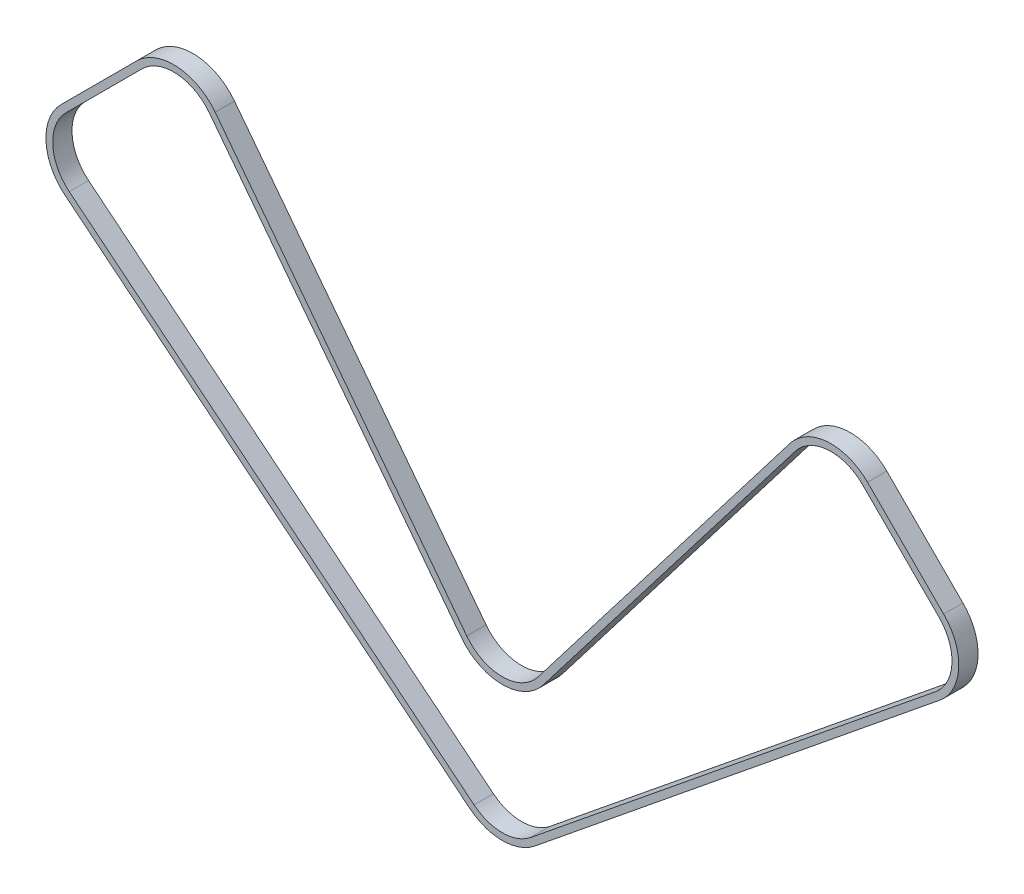
ISO-10303-21;
HEADER;
FILE_DESCRIPTION(('STEP AP214'),'2;1');
FILE_NAME('part.step','',(''),(''),'','','');
FILE_SCHEMA(('AUTOMOTIVE_DESIGN { 1 0 10303 214 1 1 1 1 }'));
ENDSEC;
DATA;
#1=APPLICATION_CONTEXT('core data for automotive mechanical design processes');
#2=APPLICATION_PROTOCOL_DEFINITION('international standard','automotive_design',2000,#1);
#3=PRODUCT_CONTEXT('',#1,'mechanical');
#4=PRODUCT('Part','Part','',(#3));
#5=PRODUCT_RELATED_PRODUCT_CATEGORY('part','',(#4));
#6=PRODUCT_DEFINITION_FORMATION('','',#4);
#7=PRODUCT_DEFINITION_CONTEXT('part definition',#1,'design');
#8=PRODUCT_DEFINITION('design','',#6,#7);
#9=PRODUCT_DEFINITION_SHAPE('','',#8);
#10=(LENGTH_UNIT() NAMED_UNIT(*) SI_UNIT(.MILLI.,.METRE.));
#11=(NAMED_UNIT(*) PLANE_ANGLE_UNIT() SI_UNIT($,.RADIAN.));
#12=(NAMED_UNIT(*) SI_UNIT($,.STERADIAN.) SOLID_ANGLE_UNIT());
#13=UNCERTAINTY_MEASURE_WITH_UNIT(LENGTH_MEASURE(1.E-05),#10,'distance_accuracy_value','');
#14=(GEOMETRIC_REPRESENTATION_CONTEXT(3) GLOBAL_UNCERTAINTY_ASSIGNED_CONTEXT((#13)) GLOBAL_UNIT_ASSIGNED_CONTEXT((#10,
#11,#12)) REPRESENTATION_CONTEXT('',''));
#15=CARTESIAN_POINT('',(0.,0.,0.));
#16=DIRECTION('',(0.,0.,1.));
#17=DIRECTION('',(1.,0.,0.));
#18=AXIS2_PLACEMENT_3D('',#15,#16,#17);
#19=CARTESIAN_POINT('',(0.,0.,-5.));
#20=DIRECTION('',(0.,0.,1.));
#21=DIRECTION('',(1.,0.,0.));
#22=AXIS2_PLACEMENT_3D('',#19,#20,#21);
#23=CYLINDRICAL_SURFACE('',#22,26.75);
#24=DIRECTION('',(0.,0.,1.));
#25=VECTOR('',#24,1.);
#26=CARTESIAN_POINT('',(16.8604888104443,-20.7674364588623,-5.));
#27=LINE('',#26,#25);
#28=CARTESIAN_POINT('',(16.8604888104443,-20.7674364588623,-5.));
#29=VERTEX_POINT('',#28);
#30=CARTESIAN_POINT('',(16.8604888104443,-20.7674364588623,5.));
#31=VERTEX_POINT('',#30);
#32=EDGE_CURVE('E40',#29,#31,#27,.T.);
#33=ORIENTED_EDGE('',*,*,#32,.T.);
#34=CARTESIAN_POINT('',(0.,0.,5.));
#35=DIRECTION('',(0.,0.,1.));
#36=DIRECTION('',(1.,0.,0.));
#37=AXIS2_PLACEMENT_3D('',#34,#35,#36);
#38=CIRCLE('',#37,26.75);
#39=CARTESIAN_POINT('',(-16.8604888104441,-20.7674364588624,5.));
#40=VERTEX_POINT('',#39);
#41=EDGE_CURVE('E253',#40,#31,#38,.T.);
#42=ORIENTED_EDGE('',*,*,#41,.F.);
#43=DIRECTION('',(0.,0.,1.));
#44=VECTOR('',#43,1.);
#45=CARTESIAN_POINT('',(-16.8604888104441,-20.7674364588624,-5.));
#46=LINE('',#45,#44);
#47=CARTESIAN_POINT('',(-16.8604888104441,-20.7674364588624,-5.));
#48=VERTEX_POINT('',#47);
#49=EDGE_CURVE('E11',#48,#40,#46,.T.);
#50=ORIENTED_EDGE('',*,*,#49,.F.);
#51=CARTESIAN_POINT('',(0.,0.,-5.));
#52=DIRECTION('',(0.,0.,1.));
#53=DIRECTION('',(1.,0.,0.));
#54=AXIS2_PLACEMENT_3D('',#51,#52,#53);
#55=CIRCLE('',#54,26.75);
#56=EDGE_CURVE('E320',#48,#29,#55,.T.);
#57=ORIENTED_EDGE('',*,*,#56,.T.);
#58=EDGE_LOOP('',(#33,#42,#50,#57));
#59=FACE_BOUND('',#58,.T.);
#60=ADVANCED_FACE('F37',(#59),#23,.T.);
#61=CARTESIAN_POINT('',(-226.569637525832,149.489434790871,-5.));
#62=DIRECTION('',(-0.630298647119406,-0.776352764817287,0.));
#63=DIRECTION('',(0.776352764817287,-0.630298647119406,0.));
#64=AXIS2_PLACEMENT_3D('',#61,#62,#63);
#65=PLANE('',#64);
#66=ORIENTED_EDGE('',*,*,#49,.T.);
#67=DIRECTION('',(0.776352764817287,-0.630298647119406,0.));
#68=VECTOR('',#67,1.);
#69=CARTESIAN_POINT('',(-226.569637525832,149.489434790871,5.));
#70=LINE('',#69,#68);
#71=CARTESIAN_POINT('',(-226.569637525832,149.489434790871,5.));
#72=VERTEX_POINT('',#71);
#73=EDGE_CURVE('E286',#72,#40,#70,.T.);
#74=ORIENTED_EDGE('',*,*,#73,.F.);
#75=DIRECTION('',(0.,0.,1.));
#76=VECTOR('',#75,1.);
#77=CARTESIAN_POINT('',(-226.569637525832,149.489434790871,-5.));
#78=LINE('',#77,#76);
#79=CARTESIAN_POINT('',(-226.569637525832,149.489434790871,-5.));
#80=VERTEX_POINT('',#79);
#81=EDGE_CURVE('E45',#80,#72,#78,.T.);
#82=ORIENTED_EDGE('',*,*,#81,.F.);
#83=DIRECTION('',(0.776352764817287,-0.630298647119406,0.));
#84=VECTOR('',#83,1.);
#85=CARTESIAN_POINT('',(-226.569637525832,149.489434790871,-5.));
#86=LINE('',#85,#84);
#87=EDGE_CURVE('E371',#80,#48,#86,.T.);
#88=ORIENTED_EDGE('',*,*,#87,.T.);
#89=EDGE_LOOP('',(#66,#74,#82,#88));
#90=FACE_BOUND('',#89,.T.);
#91=ADVANCED_FACE('F400',(#90),#65,.T.);
#92=CARTESIAN_POINT('',(-209.709148715388,170.256871249733,-5.));
#93=DIRECTION('',(0.,0.,1.));
#94=DIRECTION('',(1.,0.,0.));
#95=AXIS2_PLACEMENT_3D('',#92,#93,#94);
#96=CYLINDRICAL_SURFACE('',#95,26.75);
#97=ORIENTED_EDGE('',*,*,#81,.T.);
#98=CARTESIAN_POINT('',(-209.709148715388,170.256871249733,5.));
#99=DIRECTION('',(0.,0.,1.));
#100=DIRECTION('',(1.,0.,0.));
#101=AXIS2_PLACEMENT_3D('',#98,#99,#100);
#102=CIRCLE('',#101,26.75);
#103=CARTESIAN_POINT('',(-228.624255112128,189.171977646473,5.));
#104=VERTEX_POINT('',#103);
#105=EDGE_CURVE('E283',#104,#72,#102,.T.);
#106=ORIENTED_EDGE('',*,*,#105,.F.);
#107=DIRECTION('',(0.,0.,1.));
#108=VECTOR('',#107,1.);
#109=CARTESIAN_POINT('',(-228.624255112128,189.171977646473,-5.));
#110=LINE('',#109,#108);
#111=CARTESIAN_POINT('',(-228.624255112128,189.171977646473,-5.));
#112=VERTEX_POINT('',#111);
#113=EDGE_CURVE('E375',#112,#104,#110,.T.);
#114=ORIENTED_EDGE('',*,*,#113,.F.);
#115=CARTESIAN_POINT('',(-209.709148715388,170.256871249733,-5.));
#116=DIRECTION('',(0.,0.,1.));
#117=DIRECTION('',(1.,0.,0.));
#118=AXIS2_PLACEMENT_3D('',#115,#116,#117);
#119=CIRCLE('',#118,26.75);
#120=EDGE_CURVE('E368',#112,#80,#119,.T.);
#121=ORIENTED_EDGE('',*,*,#120,.T.);
#122=EDGE_LOOP('',(#97,#106,#114,#121));
#123=FACE_BOUND('',#122,.T.);
#124=ADVANCED_FACE('F437',(#123),#96,.T.);
#125=CARTESIAN_POINT('',(-189.171977646479,228.624255112124,-5.));
#126=DIRECTION('',(-0.707106781186563,0.707106781186532,0.));
#127=DIRECTION('',(-0.707106781186532,-0.707106781186563,0.));
#128=AXIS2_PLACEMENT_3D('',#125,#126,#127);
#129=PLANE('',#128);
#130=ORIENTED_EDGE('',*,*,#113,.T.);
#131=DIRECTION('',(-0.707106781186532,-0.707106781186563,0.));
#132=VECTOR('',#131,1.);
#133=CARTESIAN_POINT('',(-189.171977646479,228.624255112124,5.));
#134=LINE('',#133,#132);
#135=CARTESIAN_POINT('',(-189.171977646479,228.624255112124,5.));
#136=VERTEX_POINT('',#135);
#137=EDGE_CURVE('E280',#136,#104,#134,.T.);
#138=ORIENTED_EDGE('',*,*,#137,.F.);
#139=DIRECTION('',(0.,0.,1.));
#140=VECTOR('',#139,1.);
#141=CARTESIAN_POINT('',(-189.171977646479,228.624255112124,-5.));
#142=LINE('',#141,#140);
#143=CARTESIAN_POINT('',(-189.171977646479,228.624255112124,-5.));
#144=VERTEX_POINT('',#143);
#145=EDGE_CURVE('E377',#144,#136,#142,.T.);
#146=ORIENTED_EDGE('',*,*,#145,.F.);
#147=DIRECTION('',(-0.707106781186532,-0.707106781186563,0.));
#148=VECTOR('',#147,1.);
#149=CARTESIAN_POINT('',(-189.171977646479,228.624255112124,-5.));
#150=LINE('',#149,#148);
#151=EDGE_CURVE('E365',#144,#112,#150,.T.);
#152=ORIENTED_EDGE('',*,*,#151,.T.);
#153=EDGE_LOOP('',(#130,#138,#146,#152));
#154=FACE_BOUND('',#153,.T.);
#155=ADVANCED_FACE('F435',(#154),#129,.T.);
#156=CARTESIAN_POINT('',(-170.300021941175,209.123665558032,-5.));
#157=DIRECTION('',(0.,0.,1.));
#158=DIRECTION('',(1.,0.,0.));
#159=AXIS2_PLACEMENT_3D('',#156,#157,#158);
#160=CYLINDRICAL_SURFACE('',#159,27.1371277975421);
#161=ORIENTED_EDGE('',*,*,#145,.T.);
#162=CARTESIAN_POINT('',(-170.300021941175,209.123665558032,5.));
#163=DIRECTION('',(0.,0.,1.));
#164=DIRECTION('',(1.,0.,0.));
#165=AXIS2_PLACEMENT_3D('',#162,#163,#164);
#166=CIRCLE('',#165,27.1371277975421);
#167=CARTESIAN_POINT('',(-148.77308072848,225.64681619964,5.));
#168=VERTEX_POINT('',#167);
#169=EDGE_CURVE('E277',#168,#136,#166,.T.);
#170=ORIENTED_EDGE('',*,*,#169,.F.);
#171=DIRECTION('',(0.,0.,1.));
#172=VECTOR('',#171,1.);
#173=CARTESIAN_POINT('',(-148.77308072848,225.64681619964,-5.));
#174=LINE('',#173,#172);
#175=CARTESIAN_POINT('',(-148.77308072848,225.64681619964,-5.));
#176=VERTEX_POINT('',#175);
#177=EDGE_CURVE('E379',#176,#168,#174,.T.);
#178=ORIENTED_EDGE('',*,*,#177,.F.);
#179=CARTESIAN_POINT('',(-170.300021941175,209.123665558032,-5.));
#180=DIRECTION('',(0.,0.,1.));
#181=DIRECTION('',(1.,0.,0.));
#182=AXIS2_PLACEMENT_3D('',#179,#180,#181);
#183=CIRCLE('',#182,27.1371277975421);
#184=EDGE_CURVE('E362',#176,#144,#183,.T.);
#185=ORIENTED_EDGE('',*,*,#184,.T.);
#186=EDGE_LOOP('',(#161,#170,#178,#185));
#187=FACE_BOUND('',#186,.T.);
#188=ADVANCED_FACE('F431',(#187),#160,.T.);
#189=CARTESIAN_POINT('',(-148.77308072848,225.64681619964,-5.));
#190=DIRECTION('',(0.793265277493555,0.608876177496765,0.));
#191=DIRECTION('',(-0.608876177496765,0.793265277493556,0.));
#192=AXIS2_PLACEMENT_3D('',#189,#190,#191);
#193=PLANE('',#192);
#194=ORIENTED_EDGE('',*,*,#177,.T.);
#195=DIRECTION('',(-0.608876177496765,0.793265277493555,0.));
#196=VECTOR('',#195,1.);
#197=CARTESIAN_POINT('',(-148.77308072848,225.64681619964,5.));
#198=LINE('',#197,#196);
#199=CARTESIAN_POINT('',(-18.4409432538528,55.8455281525519,5.));
#200=VERTEX_POINT('',#199);
#201=EDGE_CURVE('E274',#200,#168,#198,.T.);
#202=ORIENTED_EDGE('',*,*,#201,.F.);
#203=DIRECTION('',(0.,0.,1.));
#204=VECTOR('',#203,1.);
#205=CARTESIAN_POINT('',(-18.4409432538528,55.8455281525519,-5.));
#206=LINE('',#205,#204);
#207=CARTESIAN_POINT('',(-18.4409432538528,55.8455281525519,-5.));
#208=VERTEX_POINT('',#207);
#209=EDGE_CURVE('E381',#208,#200,#206,.T.);
#210=ORIENTED_EDGE('',*,*,#209,.F.);
#211=DIRECTION('',(-0.608876177496765,0.793265277493555,0.));
#212=VECTOR('',#211,1.);
#213=CARTESIAN_POINT('',(-148.77308072848,225.64681619964,-5.));
#214=LINE('',#213,#212);
#215=EDGE_CURVE('E359',#208,#176,#214,.T.);
#216=ORIENTED_EDGE('',*,*,#215,.T.);
#217=EDGE_LOOP('',(#194,#202,#210,#216));
#218=FACE_BOUND('',#217,.T.);
#219=ADVANCED_FACE('F428',(#218),#193,.T.);
#220=CARTESIAN_POINT('',(0.,70.,-5.));
#221=DIRECTION('',(0.,0.,1.));
#222=DIRECTION('',(1.,0.,0.));
#223=AXIS2_PLACEMENT_3D('',#220,#221,#222);
#224=CYLINDRICAL_SURFACE('',#223,23.2468806804703);
#225=ORIENTED_EDGE('',*,*,#209,.T.);
#226=CARTESIAN_POINT('',(0.,70.,5.));
#227=DIRECTION('',(0.,0.,-1.));
#228=DIRECTION('',(-1.,0.,0.));
#229=AXIS2_PLACEMENT_3D('',#226,#227,#228);
#230=CIRCLE('',#229,23.2468806804703);
#231=CARTESIAN_POINT('',(18.4409432538531,55.8455281525522,5.));
#232=VERTEX_POINT('',#231);
#233=EDGE_CURVE('E271',#232,#200,#230,.T.);
#234=ORIENTED_EDGE('',*,*,#233,.F.);
#235=DIRECTION('',(0.,0.,1.));
#236=VECTOR('',#235,1.);
#237=CARTESIAN_POINT('',(18.4409432538531,55.8455281525522,-5.));
#238=LINE('',#237,#236);
#239=CARTESIAN_POINT('',(18.4409432538531,55.8455281525522,-5.));
#240=VERTEX_POINT('',#239);
#241=EDGE_CURVE('E383',#240,#232,#238,.T.);
#242=ORIENTED_EDGE('',*,*,#241,.F.);
#243=CARTESIAN_POINT('',(0.,70.,-5.));
#244=DIRECTION('',(0.,0.,-1.));
#245=DIRECTION('',(-1.,0.,0.));
#246=AXIS2_PLACEMENT_3D('',#243,#244,#245);
#247=CIRCLE('',#246,23.2468806804703);
#248=EDGE_CURVE('E356',#240,#208,#247,.T.);
#249=ORIENTED_EDGE('',*,*,#248,.T.);
#250=EDGE_LOOP('',(#225,#234,#242,#249));
#251=FACE_BOUND('',#250,.T.);
#252=ADVANCED_FACE('F426',(#251),#224,.F.);
#253=CARTESIAN_POINT('',(18.4409432538531,55.8455281525522,-5.));
#254=DIRECTION('',(-0.793265277493566,0.608876177496751,0.));
#255=DIRECTION('',(-0.608876177496751,-0.793265277493566,0.));
#256=AXIS2_PLACEMENT_3D('',#253,#254,#255);
#257=PLANE('',#256);
#258=ORIENTED_EDGE('',*,*,#241,.T.);
#259=DIRECTION('',(-0.608876177496751,-0.793265277493566,0.));
#260=VECTOR('',#259,1.);
#261=CARTESIAN_POINT('',(18.4409432538531,55.8455281525522,5.));
#262=LINE('',#261,#260);
#263=CARTESIAN_POINT('',(148.773080728475,225.64681619964,5.));
#264=VERTEX_POINT('',#263);
#265=EDGE_CURVE('E268',#264,#232,#262,.T.);
#266=ORIENTED_EDGE('',*,*,#265,.F.);
#267=DIRECTION('',(0.,0.,1.));
#268=VECTOR('',#267,1.);
#269=CARTESIAN_POINT('',(148.773080728475,225.64681619964,-5.));
#270=LINE('',#269,#268);
#271=CARTESIAN_POINT('',(148.773080728475,225.64681619964,-5.));
#272=VERTEX_POINT('',#271);
#273=EDGE_CURVE('E385',#272,#264,#270,.T.);
#274=ORIENTED_EDGE('',*,*,#273,.F.);
#275=DIRECTION('',(-0.608876177496751,-0.793265277493566,0.));
#276=VECTOR('',#275,1.);
#277=CARTESIAN_POINT('',(18.4409432538531,55.8455281525522,-5.));
#278=LINE('',#277,#276);
#279=EDGE_CURVE('E353',#272,#240,#278,.T.);
#280=ORIENTED_EDGE('',*,*,#279,.T.);
#281=EDGE_LOOP('',(#258,#266,#274,#280));
#282=FACE_BOUND('',#281,.T.);
#283=ADVANCED_FACE('F421',(#282),#257,.T.);
#284=CARTESIAN_POINT('',(170.256871249734,209.709148715385,-5.));
#285=DIRECTION('',(0.,0.,1.));
#286=DIRECTION('',(1.,0.,0.));
#287=AXIS2_PLACEMENT_3D('',#284,#285,#286);
#288=CYLINDRICAL_SURFACE('',#287,26.75);
#289=ORIENTED_EDGE('',*,*,#273,.T.);
#290=CARTESIAN_POINT('',(170.256871249734,209.709148715385,5.));
#291=DIRECTION('',(0.,0.,1.));
#292=DIRECTION('',(1.,0.,0.));
#293=AXIS2_PLACEMENT_3D('',#290,#291,#292);
#294=CIRCLE('',#293,26.75);
#295=CARTESIAN_POINT('',(189.171977646474,228.624255112125,5.));
#296=VERTEX_POINT('',#295);
#297=EDGE_CURVE('E265',#296,#264,#294,.T.);
#298=ORIENTED_EDGE('',*,*,#297,.F.);
#299=DIRECTION('',(0.,0.,1.));
#300=VECTOR('',#299,1.);
#301=CARTESIAN_POINT('',(189.171977646474,228.624255112125,-5.));
#302=LINE('',#301,#300);
#303=CARTESIAN_POINT('',(189.171977646474,228.624255112125,-5.));
#304=VERTEX_POINT('',#303);
#305=EDGE_CURVE('E387',#304,#296,#302,.T.);
#306=ORIENTED_EDGE('',*,*,#305,.F.);
#307=CARTESIAN_POINT('',(170.256871249734,209.709148715385,-5.));
#308=DIRECTION('',(0.,0.,1.));
#309=DIRECTION('',(1.,0.,0.));
#310=AXIS2_PLACEMENT_3D('',#307,#308,#309);
#311=CIRCLE('',#310,26.75);
#312=EDGE_CURVE('E350',#304,#272,#311,.T.);
#313=ORIENTED_EDGE('',*,*,#312,.T.);
#314=EDGE_LOOP('',(#289,#298,#306,#313));
#315=FACE_BOUND('',#314,.T.);
#316=ADVANCED_FACE('F416',(#315),#288,.T.);
#317=CARTESIAN_POINT('',(228.624255112125,189.171977646474,-5.));
#318=DIRECTION('',(0.707106781186552,0.707106781186543,0.));
#319=DIRECTION('',(-0.707106781186543,0.707106781186552,0.));
#320=AXIS2_PLACEMENT_3D('',#317,#318,#319);
#321=PLANE('',#320);
#322=ORIENTED_EDGE('',*,*,#305,.T.);
#323=DIRECTION('',(-0.707106781186543,0.707106781186552,0.));
#324=VECTOR('',#323,1.);
#325=CARTESIAN_POINT('',(228.624255112125,189.171977646474,5.));
#326=LINE('',#325,#324);
#327=CARTESIAN_POINT('',(228.624255112125,189.171977646474,5.));
#328=VERTEX_POINT('',#327);
#329=EDGE_CURVE('E262',#328,#296,#326,.T.);
#330=ORIENTED_EDGE('',*,*,#329,.F.);
#331=DIRECTION('',(0.,0.,1.));
#332=VECTOR('',#331,1.);
#333=CARTESIAN_POINT('',(228.624255112125,189.171977646474,-5.));
#334=LINE('',#333,#332);
#335=CARTESIAN_POINT('',(228.624255112125,189.171977646474,-5.));
#336=VERTEX_POINT('',#335);
#337=EDGE_CURVE('E389',#336,#328,#334,.T.);
#338=ORIENTED_EDGE('',*,*,#337,.F.);
#339=DIRECTION('',(-0.707106781186543,0.707106781186552,0.));
#340=VECTOR('',#339,1.);
#341=CARTESIAN_POINT('',(228.624255112125,189.171977646474,-5.));
#342=LINE('',#341,#340);
#343=EDGE_CURVE('E347',#336,#304,#342,.T.);
#344=ORIENTED_EDGE('',*,*,#343,.T.);
#345=EDGE_LOOP('',(#322,#330,#338,#344));
#346=FACE_BOUND('',#345,.T.);
#347=ADVANCED_FACE('F414',(#346),#321,.T.);
#348=CARTESIAN_POINT('',(209.709148715385,170.256871249734,-5.));
#349=DIRECTION('',(0.,0.,1.));
#350=DIRECTION('',(1.,0.,0.));
#351=AXIS2_PLACEMENT_3D('',#348,#349,#350);
#352=CYLINDRICAL_SURFACE('',#351,26.75);
#353=ORIENTED_EDGE('',*,*,#337,.T.);
#354=CARTESIAN_POINT('',(209.709148715385,170.256871249734,5.));
#355=DIRECTION('',(0.,0.,1.));
#356=DIRECTION('',(1.,0.,0.));
#357=AXIS2_PLACEMENT_3D('',#354,#355,#356);
#358=CIRCLE('',#357,26.75);
#359=CARTESIAN_POINT('',(226.569637525829,149.489434790872,5.));
#360=VERTEX_POINT('',#359);
#361=EDGE_CURVE('E259',#360,#328,#358,.T.);
#362=ORIENTED_EDGE('',*,*,#361,.F.);
#363=DIRECTION('',(0.,0.,1.));
#364=VECTOR('',#363,1.);
#365=CARTESIAN_POINT('',(226.569637525829,149.489434790872,-5.));
#366=LINE('',#365,#364);
#367=CARTESIAN_POINT('',(226.569637525829,149.489434790872,-5.));
#368=VERTEX_POINT('',#367);
#369=EDGE_CURVE('E390',#368,#360,#366,.T.);
#370=ORIENTED_EDGE('',*,*,#369,.F.);
#371=CARTESIAN_POINT('',(209.709148715385,170.256871249734,-5.));
#372=DIRECTION('',(0.,0.,1.));
#373=DIRECTION('',(1.,0.,0.));
#374=AXIS2_PLACEMENT_3D('',#371,#372,#373);
#375=CIRCLE('',#374,26.75);
#376=EDGE_CURVE('E344',#368,#336,#375,.T.);
#377=ORIENTED_EDGE('',*,*,#376,.T.);
#378=EDGE_LOOP('',(#353,#362,#370,#377));
#379=FACE_BOUND('',#378,.T.);
#380=ADVANCED_FACE('F410',(#379),#352,.T.);
#381=CARTESIAN_POINT('',(16.8604888104443,-20.7674364588623,-5.));
#382=DIRECTION('',(0.630298647119414,-0.776352764817281,0.));
#383=DIRECTION('',(0.776352764817281,0.630298647119414,0.));
#384=AXIS2_PLACEMENT_3D('',#381,#382,#383);
#385=PLANE('',#384);
#386=ORIENTED_EDGE('',*,*,#369,.T.);
#387=DIRECTION('',(0.776352764817281,0.630298647119414,0.));
#388=VECTOR('',#387,1.);
#389=CARTESIAN_POINT('',(16.8604888104443,-20.7674364588623,5.));
#390=LINE('',#389,#388);
#391=EDGE_CURVE('E256',#31,#360,#390,.T.);
#392=ORIENTED_EDGE('',*,*,#391,.F.);
#393=ORIENTED_EDGE('',*,*,#32,.F.);
#394=DIRECTION('',(0.776352764817281,0.630298647119414,0.));
#395=VECTOR('',#394,1.);
#396=CARTESIAN_POINT('',(16.8604888104443,-20.7674364588623,-5.));
#397=LINE('',#396,#395);
#398=EDGE_CURVE('E341',#29,#368,#397,.T.);
#399=ORIENTED_EDGE('',*,*,#398,.T.);
#400=EDGE_LOOP('',(#386,#392,#393,#399));
#401=FACE_BOUND('',#400,.T.);
#402=ADVANCED_FACE('F394',(#401),#385,.T.);
#403=CARTESIAN_POINT('',(0.,0.,-5.));
#404=DIRECTION('',(0.,0.,1.));
#405=DIRECTION('',(1.,0.,0.));
#406=AXIS2_PLACEMENT_3D('',#403,#404,#405);
#407=PLANE('',#406);
#408=DIRECTION('',(-0.608876177496765,0.793265277493555,0.));
#409=VECTOR('',#408,1.);
#410=CARTESIAN_POINT('',(-21.4837905212582,54.0623325157445,-5.));
#411=LINE('',#410,#409);
#412=CARTESIAN_POINT('',(-21.4837905212582,54.0623325157445,-5.));
#413=VERTEX_POINT('',#412);
#414=CARTESIAN_POINT('',(-151.815927995885,223.863620562833,-5.));
#415=VERTEX_POINT('',#414);
#416=EDGE_CURVE('E210',#413,#415,#411,.T.);
#417=ORIENTED_EDGE('',*,*,#416,.T.);
#418=CARTESIAN_POINT('',(-170.256871249738,209.709148715385,-5.));
#419=DIRECTION('',(0.,0.,1.));
#420=DIRECTION('',(-1.,0.,0.));
#421=AXIS2_PLACEMENT_3D('',#418,#419,#420);
#422=CIRCLE('',#421,23.2468806804702);
#423=CARTESIAN_POINT('',(-186.694898220334,226.147175685979,-5.));
#424=VERTEX_POINT('',#423);
#425=EDGE_CURVE('E289',#415,#424,#422,.T.);
#426=ORIENTED_EDGE('',*,*,#425,.T.);
#427=DIRECTION('',(-0.707106781186532,-0.707106781186563,0.));
#428=VECTOR('',#427,1.);
#429=CARTESIAN_POINT('',(-186.694898220334,226.147175685979,-5.));
#430=LINE('',#429,#428);
#431=CARTESIAN_POINT('',(-226.147175685983,186.694898220328,-5.));
#432=VERTEX_POINT('',#431);
#433=EDGE_CURVE('E205',#424,#432,#430,.T.);
#434=ORIENTED_EDGE('',*,*,#433,.T.);
#435=CARTESIAN_POINT('',(-209.709148715388,170.256871249733,-5.));
#436=DIRECTION('',(0.,0.,1.));
#437=DIRECTION('',(1.,0.,0.));
#438=AXIS2_PLACEMENT_3D('',#435,#436,#437);
#439=CIRCLE('',#438,23.2468806804702);
#440=CARTESIAN_POINT('',(-224.361626158034,152.209091160073,-5.));
#441=VERTEX_POINT('',#440);
#442=EDGE_CURVE('E53',#432,#441,#439,.T.);
#443=ORIENTED_EDGE('',*,*,#442,.T.);
#444=DIRECTION('',(0.776352764817287,-0.630298647119406,0.));
#445=VECTOR('',#444,1.);
#446=CARTESIAN_POINT('',(-224.361626158034,152.209091160073,-5.));
#447=LINE('',#446,#445);
#448=CARTESIAN_POINT('',(-14.6524774426466,-18.0477800896606,-5.));
#449=VERTEX_POINT('',#448);
#450=EDGE_CURVE('E293',#441,#449,#447,.T.);
#451=ORIENTED_EDGE('',*,*,#450,.T.);
#452=CARTESIAN_POINT('',(0.,0.,-5.));
#453=DIRECTION('',(0.,0.,1.));
#454=DIRECTION('',(1.,0.,0.));
#455=AXIS2_PLACEMENT_3D('',#452,#453,#454);
#456=CIRCLE('',#455,23.2468806804702);
#457=CARTESIAN_POINT('',(14.6524774426468,-18.0477800896605,-5.));
#458=VERTEX_POINT('',#457);
#459=EDGE_CURVE('E296',#449,#458,#456,.T.);
#460=ORIENTED_EDGE('',*,*,#459,.T.);
#461=DIRECTION('',(0.776352764817281,0.630298647119414,0.));
#462=VECTOR('',#461,1.);
#463=CARTESIAN_POINT('',(14.6524774426468,-18.0477800896605,-5.));
#464=LINE('',#463,#462);
#465=CARTESIAN_POINT('',(224.361626158031,152.209091160073,-5.));
#466=VERTEX_POINT('',#465);
#467=EDGE_CURVE('E299',#458,#466,#464,.T.);
#468=ORIENTED_EDGE('',*,*,#467,.T.);
#469=CARTESIAN_POINT('',(209.709148715385,170.256871249734,-5.));
#470=DIRECTION('',(0.,0.,1.));
#471=DIRECTION('',(-1.,0.,0.));
#472=AXIS2_PLACEMENT_3D('',#469,#470,#471);
#473=CIRCLE('',#472,23.2468806804704);
#474=CARTESIAN_POINT('',(226.14717568598,186.694898220329,-5.));
#475=VERTEX_POINT('',#474);
#476=EDGE_CURVE('E302',#466,#475,#473,.T.);
#477=ORIENTED_EDGE('',*,*,#476,.T.);
#478=DIRECTION('',(-0.707106781186544,0.707106781186552,0.));
#479=VECTOR('',#478,1.);
#480=CARTESIAN_POINT('',(186.694898220329,226.14717568598,-5.));
#481=LINE('',#480,#479);
#482=CARTESIAN_POINT('',(186.694898220329,226.14717568598,-5.));
#483=VERTEX_POINT('',#482);
#484=EDGE_CURVE('E305',#475,#483,#481,.T.);
#485=ORIENTED_EDGE('',*,*,#484,.T.);
#486=CARTESIAN_POINT('',(170.256871249734,209.709148715385,-5.));
#487=DIRECTION('',(0.,0.,1.));
#488=DIRECTION('',(-1.,0.,0.));
#489=AXIS2_PLACEMENT_3D('',#486,#487,#488);
#490=CIRCLE('',#489,23.2468806804704);
#491=CARTESIAN_POINT('',(151.815927995881,223.863620562833,-5.));
#492=VERTEX_POINT('',#491);
#493=EDGE_CURVE('E308',#483,#492,#490,.T.);
#494=ORIENTED_EDGE('',*,*,#493,.T.);
#495=DIRECTION('',(-0.608876177496751,-0.793265277493567,0.));
#496=VECTOR('',#495,1.);
#497=CARTESIAN_POINT('',(21.4837905212585,54.0623325157449,-5.));
#498=LINE('',#497,#496);
#499=CARTESIAN_POINT('',(21.4837905212585,54.0623325157449,-5.));
#500=VERTEX_POINT('',#499);
#501=EDGE_CURVE('E311',#492,#500,#498,.T.);
#502=ORIENTED_EDGE('',*,*,#501,.T.);
#503=CARTESIAN_POINT('',(0.,70.,-5.));
#504=DIRECTION('',(0.,0.,-1.));
#505=DIRECTION('',(-1.,0.,0.));
#506=AXIS2_PLACEMENT_3D('',#503,#504,#505);
#507=CIRCLE('',#506,26.75);
#508=EDGE_CURVE('E314',#500,#413,#507,.T.);
#509=ORIENTED_EDGE('',*,*,#508,.T.);
#510=EDGE_LOOP('',(#417,#426,#434,#443,#451,#460,#468,#477,#485,#494,#502,#509));
#511=FACE_BOUND('',#510,.T.);
#512=ORIENTED_EDGE('',*,*,#56,.F.);
#513=ORIENTED_EDGE('',*,*,#87,.F.);
#514=ORIENTED_EDGE('',*,*,#120,.F.);
#515=ORIENTED_EDGE('',*,*,#151,.F.);
#516=ORIENTED_EDGE('',*,*,#184,.F.);
#517=ORIENTED_EDGE('',*,*,#215,.F.);
#518=ORIENTED_EDGE('',*,*,#248,.F.);
#519=ORIENTED_EDGE('',*,*,#279,.F.);
#520=ORIENTED_EDGE('',*,*,#312,.F.);
#521=ORIENTED_EDGE('',*,*,#343,.F.);
#522=ORIENTED_EDGE('',*,*,#376,.F.);
#523=ORIENTED_EDGE('',*,*,#398,.F.);
#524=EDGE_LOOP('',(#512,#513,#514,#515,#516,#517,#518,#519,#520,#521,#522,#523));
#525=FACE_BOUND('',#524,.T.);
#526=ADVANCED_FACE('F404',(#511,#525),#407,.F.);
#527=CARTESIAN_POINT('',(-170.256871249738,209.709148715385,-5.));
#528=DIRECTION('',(0.,0.,1.));
#529=DIRECTION('',(1.,0.,0.));
#530=AXIS2_PLACEMENT_3D('',#527,#528,#529);
#531=CYLINDRICAL_SURFACE('',#530,23.2468806804702);
#532=DIRECTION('',(0.,0.,1.));
#533=VECTOR('',#532,1.);
#534=CARTESIAN_POINT('',(-151.815927995885,223.863620562833,-5.));
#535=LINE('',#534,#533);
#536=CARTESIAN_POINT('',(-151.815927995885,223.863620562833,5.));
#537=VERTEX_POINT('',#536);
#538=EDGE_CURVE('E215',#415,#537,#535,.T.);
#539=ORIENTED_EDGE('',*,*,#538,.T.);
#540=CARTESIAN_POINT('',(-170.256871249738,209.709148715385,5.));
#541=DIRECTION('',(0.,0.,1.));
#542=DIRECTION('',(-1.,0.,0.));
#543=AXIS2_PLACEMENT_3D('',#540,#541,#542);
#544=CIRCLE('',#543,23.2468806804702);
#545=CARTESIAN_POINT('',(-186.694898220334,226.147175685979,5.));
#546=VERTEX_POINT('',#545);
#547=EDGE_CURVE('E213',#537,#546,#544,.T.);
#548=ORIENTED_EDGE('',*,*,#547,.T.);
#549=DIRECTION('',(0.,0.,1.));
#550=VECTOR('',#549,1.);
#551=CARTESIAN_POINT('',(-186.694898220334,226.147175685979,-5.));
#552=LINE('',#551,#550);
#553=EDGE_CURVE('E198',#424,#546,#552,.T.);
#554=ORIENTED_EDGE('',*,*,#553,.F.);
#555=ORIENTED_EDGE('',*,*,#425,.F.);
#556=EDGE_LOOP('',(#539,#548,#554,#555));
#557=FACE_BOUND('',#556,.T.);
#558=ADVANCED_FACE('F214',(#557),#531,.F.);
#559=CARTESIAN_POINT('',(-21.4837905212582,54.0623325157445,-5.));
#560=DIRECTION('',(0.793265277493555,0.608876177496765,0.));
#561=DIRECTION('',(-0.608876177496765,0.793265277493556,0.));
#562=AXIS2_PLACEMENT_3D('',#559,#560,#561);
#563=PLANE('',#562);
#564=DIRECTION('',(0.,0.,1.));
#565=VECTOR('',#564,1.);
#566=CARTESIAN_POINT('',(-21.4837905212582,54.0623325157445,-5.));
#567=LINE('',#566,#565);
#568=CARTESIAN_POINT('',(-21.4837905212582,54.0623325157445,5.));
#569=VERTEX_POINT('',#568);
#570=EDGE_CURVE('E321',#413,#569,#567,.T.);
#571=ORIENTED_EDGE('',*,*,#570,.T.);
#572=DIRECTION('',(-0.608876177496765,0.793265277493555,0.));
#573=VECTOR('',#572,1.);
#574=CARTESIAN_POINT('',(-21.4837905212582,54.0623325157445,5.));
#575=LINE('',#574,#573);
#576=EDGE_CURVE('E251',#569,#537,#575,.T.);
#577=ORIENTED_EDGE('',*,*,#576,.T.);
#578=ORIENTED_EDGE('',*,*,#538,.F.);
#579=ORIENTED_EDGE('',*,*,#416,.F.);
#580=EDGE_LOOP('',(#571,#577,#578,#579));
#581=FACE_BOUND('',#580,.T.);
#582=ADVANCED_FACE('F545',(#581),#563,.F.);
#583=CARTESIAN_POINT('',(0.,70.,-5.));
#584=DIRECTION('',(0.,0.,1.));
#585=DIRECTION('',(1.,0.,0.));
#586=AXIS2_PLACEMENT_3D('',#583,#584,#585);
#587=CYLINDRICAL_SURFACE('',#586,26.75);
#588=DIRECTION('',(0.,0.,1.));
#589=VECTOR('',#588,1.);
#590=CARTESIAN_POINT('',(21.4837905212585,54.0623325157449,-5.));
#591=LINE('',#590,#589);
#592=CARTESIAN_POINT('',(21.4837905212585,54.0623325157449,5.));
#593=VERTEX_POINT('',#592);
#594=EDGE_CURVE('E323',#500,#593,#591,.T.);
#595=ORIENTED_EDGE('',*,*,#594,.T.);
#596=CARTESIAN_POINT('',(0.,70.,5.));
#597=DIRECTION('',(0.,0.,-1.));
#598=DIRECTION('',(-1.,0.,0.));
#599=AXIS2_PLACEMENT_3D('',#596,#597,#598);
#600=CIRCLE('',#599,26.75);
#601=EDGE_CURVE('E248',#593,#569,#600,.T.);
#602=ORIENTED_EDGE('',*,*,#601,.T.);
#603=ORIENTED_EDGE('',*,*,#570,.F.);
#604=ORIENTED_EDGE('',*,*,#508,.F.);
#605=EDGE_LOOP('',(#595,#602,#603,#604));
#606=FACE_BOUND('',#605,.T.);
#607=ADVANCED_FACE('F554',(#606),#587,.T.);
#608=CARTESIAN_POINT('',(21.4837905212585,54.0623325157449,-5.));
#609=DIRECTION('',(-0.793265277493567,0.608876177496751,0.));
#610=DIRECTION('',(-0.608876177496751,-0.793265277493567,0.));
#611=AXIS2_PLACEMENT_3D('',#608,#609,#610);
#612=PLANE('',#611);
#613=DIRECTION('',(0.,0.,1.));
#614=VECTOR('',#613,1.);
#615=CARTESIAN_POINT('',(151.815927995881,223.863620562833,-5.));
#616=LINE('',#615,#614);
#617=CARTESIAN_POINT('',(151.815927995881,223.863620562833,5.));
#618=VERTEX_POINT('',#617);
#619=EDGE_CURVE('E325',#492,#618,#616,.T.);
#620=ORIENTED_EDGE('',*,*,#619,.T.);
#621=DIRECTION('',(-0.608876177496751,-0.793265277493567,0.));
#622=VECTOR('',#621,1.);
#623=CARTESIAN_POINT('',(21.4837905212585,54.0623325157449,5.));
#624=LINE('',#623,#622);
#625=EDGE_CURVE('E245',#618,#593,#624,.T.);
#626=ORIENTED_EDGE('',*,*,#625,.T.);
#627=ORIENTED_EDGE('',*,*,#594,.F.);
#628=ORIENTED_EDGE('',*,*,#501,.F.);
#629=EDGE_LOOP('',(#620,#626,#627,#628));
#630=FACE_BOUND('',#629,.T.);
#631=ADVANCED_FACE('F564',(#630),#612,.F.);
#632=CARTESIAN_POINT('',(170.256871249734,209.709148715385,-5.));
#633=DIRECTION('',(0.,0.,1.));
#634=DIRECTION('',(1.,0.,0.));
#635=AXIS2_PLACEMENT_3D('',#632,#633,#634);
#636=CYLINDRICAL_SURFACE('',#635,23.2468806804704);
#637=DIRECTION('',(0.,0.,1.));
#638=VECTOR('',#637,1.);
#639=CARTESIAN_POINT('',(186.694898220329,226.14717568598,-5.));
#640=LINE('',#639,#638);
#641=CARTESIAN_POINT('',(186.694898220329,226.14717568598,5.));
#642=VERTEX_POINT('',#641);
#643=EDGE_CURVE('E327',#483,#642,#640,.T.);
#644=ORIENTED_EDGE('',*,*,#643,.T.);
#645=CARTESIAN_POINT('',(170.256871249734,209.709148715385,5.));
#646=DIRECTION('',(0.,0.,1.));
#647=DIRECTION('',(-1.,0.,0.));
#648=AXIS2_PLACEMENT_3D('',#645,#646,#647);
#649=CIRCLE('',#648,23.2468806804704);
#650=EDGE_CURVE('E242',#642,#618,#649,.T.);
#651=ORIENTED_EDGE('',*,*,#650,.T.);
#652=ORIENTED_EDGE('',*,*,#619,.F.);
#653=ORIENTED_EDGE('',*,*,#493,.F.);
#654=EDGE_LOOP('',(#644,#651,#652,#653));
#655=FACE_BOUND('',#654,.T.);
#656=ADVANCED_FACE('F574',(#655),#636,.F.);
#657=CARTESIAN_POINT('',(186.694898220329,226.14717568598,-5.));
#658=DIRECTION('',(0.707106781186552,0.707106781186544,0.));
#659=DIRECTION('',(-0.707106781186544,0.707106781186551,0.));
#660=AXIS2_PLACEMENT_3D('',#657,#658,#659);
#661=PLANE('',#660);
#662=DIRECTION('',(0.,0.,1.));
#663=VECTOR('',#662,1.);
#664=CARTESIAN_POINT('',(226.14717568598,186.694898220329,-5.));
#665=LINE('',#664,#663);
#666=CARTESIAN_POINT('',(226.14717568598,186.694898220329,5.));
#667=VERTEX_POINT('',#666);
#668=EDGE_CURVE('E329',#475,#667,#665,.T.);
#669=ORIENTED_EDGE('',*,*,#668,.T.);
#670=DIRECTION('',(-0.707106781186544,0.707106781186552,0.));
#671=VECTOR('',#670,1.);
#672=CARTESIAN_POINT('',(186.694898220329,226.14717568598,5.));
#673=LINE('',#672,#671);
#674=EDGE_CURVE('E239',#667,#642,#673,.T.);
#675=ORIENTED_EDGE('',*,*,#674,.T.);
#676=ORIENTED_EDGE('',*,*,#643,.F.);
#677=ORIENTED_EDGE('',*,*,#484,.F.);
#678=EDGE_LOOP('',(#669,#675,#676,#677));
#679=FACE_BOUND('',#678,.T.);
#680=ADVANCED_FACE('F584',(#679),#661,.F.);
#681=CARTESIAN_POINT('',(209.709148715385,170.256871249734,-5.));
#682=DIRECTION('',(0.,0.,1.));
#683=DIRECTION('',(1.,0.,0.));
#684=AXIS2_PLACEMENT_3D('',#681,#682,#683);
#685=CYLINDRICAL_SURFACE('',#684,23.2468806804704);
#686=DIRECTION('',(0.,0.,1.));
#687=VECTOR('',#686,1.);
#688=CARTESIAN_POINT('',(224.361626158031,152.209091160073,-5.));
#689=LINE('',#688,#687);
#690=CARTESIAN_POINT('',(224.361626158031,152.209091160073,5.));
#691=VERTEX_POINT('',#690);
#692=EDGE_CURVE('E331',#466,#691,#689,.T.);
#693=ORIENTED_EDGE('',*,*,#692,.T.);
#694=CARTESIAN_POINT('',(209.709148715385,170.256871249734,5.));
#695=DIRECTION('',(0.,0.,1.));
#696=DIRECTION('',(-1.,0.,0.));
#697=AXIS2_PLACEMENT_3D('',#694,#695,#696);
#698=CIRCLE('',#697,23.2468806804704);
#699=EDGE_CURVE('E236',#691,#667,#698,.T.);
#700=ORIENTED_EDGE('',*,*,#699,.T.);
#701=ORIENTED_EDGE('',*,*,#668,.F.);
#702=ORIENTED_EDGE('',*,*,#476,.F.);
#703=EDGE_LOOP('',(#693,#700,#701,#702));
#704=FACE_BOUND('',#703,.T.);
#705=ADVANCED_FACE('F594',(#704),#685,.F.);
#706=CARTESIAN_POINT('',(14.6524774426468,-18.0477800896605,-5.));
#707=DIRECTION('',(0.630298647119414,-0.776352764817281,0.));
#708=DIRECTION('',(0.776352764817281,0.630298647119414,0.));
#709=AXIS2_PLACEMENT_3D('',#706,#707,#708);
#710=PLANE('',#709);
#711=DIRECTION('',(0.,0.,1.));
#712=VECTOR('',#711,1.);
#713=CARTESIAN_POINT('',(14.6524774426468,-18.0477800896605,-5.));
#714=LINE('',#713,#712);
#715=CARTESIAN_POINT('',(14.6524774426468,-18.0477800896605,5.));
#716=VERTEX_POINT('',#715);
#717=EDGE_CURVE('E333',#458,#716,#714,.T.);
#718=ORIENTED_EDGE('',*,*,#717,.T.);
#719=DIRECTION('',(0.776352764817281,0.630298647119414,0.));
#720=VECTOR('',#719,1.);
#721=CARTESIAN_POINT('',(14.6524774426468,-18.0477800896605,5.));
#722=LINE('',#721,#720);
#723=EDGE_CURVE('E233',#716,#691,#722,.T.);
#724=ORIENTED_EDGE('',*,*,#723,.T.);
#725=ORIENTED_EDGE('',*,*,#692,.F.);
#726=ORIENTED_EDGE('',*,*,#467,.F.);
#727=EDGE_LOOP('',(#718,#724,#725,#726));
#728=FACE_BOUND('',#727,.T.);
#729=ADVANCED_FACE('F604',(#728),#710,.F.);
#730=CARTESIAN_POINT('',(0.,0.,-5.));
#731=DIRECTION('',(0.,0.,1.));
#732=DIRECTION('',(1.,0.,0.));
#733=AXIS2_PLACEMENT_3D('',#730,#731,#732);
#734=CYLINDRICAL_SURFACE('',#733,23.2468806804702);
#735=DIRECTION('',(0.,0.,1.));
#736=VECTOR('',#735,1.);
#737=CARTESIAN_POINT('',(-14.6524774426466,-18.0477800896606,-5.));
#738=LINE('',#737,#736);
#739=CARTESIAN_POINT('',(-14.6524774426466,-18.0477800896606,5.));
#740=VERTEX_POINT('',#739);
#741=EDGE_CURVE('E335',#449,#740,#738,.T.);
#742=ORIENTED_EDGE('',*,*,#741,.T.);
#743=CARTESIAN_POINT('',(0.,0.,5.));
#744=DIRECTION('',(0.,0.,1.));
#745=DIRECTION('',(1.,0.,0.));
#746=AXIS2_PLACEMENT_3D('',#743,#744,#745);
#747=CIRCLE('',#746,23.2468806804702);
#748=EDGE_CURVE('E230',#740,#716,#747,.T.);
#749=ORIENTED_EDGE('',*,*,#748,.T.);
#750=ORIENTED_EDGE('',*,*,#717,.F.);
#751=ORIENTED_EDGE('',*,*,#459,.F.);
#752=EDGE_LOOP('',(#742,#749,#750,#751));
#753=FACE_BOUND('',#752,.T.);
#754=ADVANCED_FACE('F614',(#753),#734,.F.);
#755=CARTESIAN_POINT('',(-224.361626158034,152.209091160073,-5.));
#756=DIRECTION('',(-0.630298647119406,-0.776352764817287,0.));
#757=DIRECTION('',(0.776352764817287,-0.630298647119406,0.));
#758=AXIS2_PLACEMENT_3D('',#755,#756,#757);
#759=PLANE('',#758);
#760=DIRECTION('',(0.,0.,1.));
#761=VECTOR('',#760,1.);
#762=CARTESIAN_POINT('',(-224.361626158034,152.209091160073,-5.));
#763=LINE('',#762,#761);
#764=CARTESIAN_POINT('',(-224.361626158034,152.209091160073,5.));
#765=VERTEX_POINT('',#764);
#766=EDGE_CURVE('E337',#441,#765,#763,.T.);
#767=ORIENTED_EDGE('',*,*,#766,.T.);
#768=DIRECTION('',(0.776352764817287,-0.630298647119406,0.));
#769=VECTOR('',#768,1.);
#770=CARTESIAN_POINT('',(-224.361626158034,152.209091160073,5.));
#771=LINE('',#770,#769);
#772=EDGE_CURVE('E225',#765,#740,#771,.T.);
#773=ORIENTED_EDGE('',*,*,#772,.T.);
#774=ORIENTED_EDGE('',*,*,#741,.F.);
#775=ORIENTED_EDGE('',*,*,#450,.F.);
#776=EDGE_LOOP('',(#767,#773,#774,#775));
#777=FACE_BOUND('',#776,.T.);
#778=ADVANCED_FACE('F624',(#777),#759,.F.);
#779=CARTESIAN_POINT('',(-209.709148715388,170.256871249733,-5.));
#780=DIRECTION('',(0.,0.,1.));
#781=DIRECTION('',(1.,0.,0.));
#782=AXIS2_PLACEMENT_3D('',#779,#780,#781);
#783=CYLINDRICAL_SURFACE('',#782,23.2468806804702);
#784=DIRECTION('',(0.,0.,1.));
#785=VECTOR('',#784,1.);
#786=CARTESIAN_POINT('',(-226.147175685983,186.694898220328,-5.));
#787=LINE('',#786,#785);
#788=CARTESIAN_POINT('',(-226.147175685983,186.694898220328,5.));
#789=VERTEX_POINT('',#788);
#790=EDGE_CURVE('E209',#432,#789,#787,.T.);
#791=ORIENTED_EDGE('',*,*,#790,.T.);
#792=CARTESIAN_POINT('',(-209.709148715388,170.256871249733,5.));
#793=DIRECTION('',(0.,0.,1.));
#794=DIRECTION('',(1.,0.,0.));
#795=AXIS2_PLACEMENT_3D('',#792,#793,#794);
#796=CIRCLE('',#795,23.2468806804702);
#797=EDGE_CURVE('E223',#789,#765,#796,.T.);
#798=ORIENTED_EDGE('',*,*,#797,.T.);
#799=ORIENTED_EDGE('',*,*,#766,.F.);
#800=ORIENTED_EDGE('',*,*,#442,.F.);
#801=EDGE_LOOP('',(#791,#798,#799,#800));
#802=FACE_BOUND('',#801,.T.);
#803=ADVANCED_FACE('F634',(#802),#783,.F.);
#804=CARTESIAN_POINT('',(-186.694898220334,226.147175685979,-5.));
#805=DIRECTION('',(-0.707106781186563,0.707106781186532,0.));
#806=DIRECTION('',(-0.707106781186532,-0.707106781186563,0.));
#807=AXIS2_PLACEMENT_3D('',#804,#805,#806);
#808=PLANE('',#807);
#809=ORIENTED_EDGE('',*,*,#553,.T.);
#810=DIRECTION('',(-0.707106781186532,-0.707106781186563,0.));
#811=VECTOR('',#810,1.);
#812=CARTESIAN_POINT('',(-186.694898220334,226.147175685979,5.));
#813=LINE('',#812,#811);
#814=EDGE_CURVE('E202',#546,#789,#813,.T.);
#815=ORIENTED_EDGE('',*,*,#814,.T.);
#816=ORIENTED_EDGE('',*,*,#790,.F.);
#817=ORIENTED_EDGE('',*,*,#433,.F.);
#818=EDGE_LOOP('',(#809,#815,#816,#817));
#819=FACE_BOUND('',#818,.T.);
#820=ADVANCED_FACE('F200',(#819),#808,.F.);
#821=CARTESIAN_POINT('',(0.,0.,5.));
#822=DIRECTION('',(0.,0.,1.));
#823=DIRECTION('',(1.,0.,0.));
#824=AXIS2_PLACEMENT_3D('',#821,#822,#823);
#825=PLANE('',#824);
#826=ORIENTED_EDGE('',*,*,#41,.T.);
#827=ORIENTED_EDGE('',*,*,#391,.T.);
#828=ORIENTED_EDGE('',*,*,#361,.T.);
#829=ORIENTED_EDGE('',*,*,#329,.T.);
#830=ORIENTED_EDGE('',*,*,#297,.T.);
#831=ORIENTED_EDGE('',*,*,#265,.T.);
#832=ORIENTED_EDGE('',*,*,#233,.T.);
#833=ORIENTED_EDGE('',*,*,#201,.T.);
#834=ORIENTED_EDGE('',*,*,#169,.T.);
#835=ORIENTED_EDGE('',*,*,#137,.T.);
#836=ORIENTED_EDGE('',*,*,#105,.T.);
#837=ORIENTED_EDGE('',*,*,#73,.T.);
#838=EDGE_LOOP('',(#826,#827,#828,#829,#830,#831,#832,#833,#834,#835,#836,#837));
#839=FACE_BOUND('',#838,.T.);
#840=ORIENTED_EDGE('',*,*,#814,.F.);
#841=ORIENTED_EDGE('',*,*,#547,.F.);
#842=ORIENTED_EDGE('',*,*,#576,.F.);
#843=ORIENTED_EDGE('',*,*,#601,.F.);
#844=ORIENTED_EDGE('',*,*,#625,.F.);
#845=ORIENTED_EDGE('',*,*,#650,.F.);
#846=ORIENTED_EDGE('',*,*,#674,.F.);
#847=ORIENTED_EDGE('',*,*,#699,.F.);
#848=ORIENTED_EDGE('',*,*,#723,.F.);
#849=ORIENTED_EDGE('',*,*,#748,.F.);
#850=ORIENTED_EDGE('',*,*,#772,.F.);
#851=ORIENTED_EDGE('',*,*,#797,.F.);
#852=EDGE_LOOP('',(#840,#841,#842,#843,#844,#845,#846,#847,#848,#849,#850,#851));
#853=FACE_BOUND('',#852,.T.);
#854=ADVANCED_FACE('F220',(#839,#853),#825,.T.);
#855=CLOSED_SHELL('',(#60,#91,#124,#155,#188,#219,#252,#283,#316,#347,#380,#402,#526,#558,#582,
#607,#631,#656,#680,#705,#729,#754,#778,#803,#820,#854));
#856=MANIFOLD_SOLID_BREP('B2',#855);
#857=ADVANCED_BREP_SHAPE_REPRESENTATION('',(#18,#856),#14);
#858=SHAPE_DEFINITION_REPRESENTATION(#9,#857);
ENDSEC;
END-ISO-10303-21;
